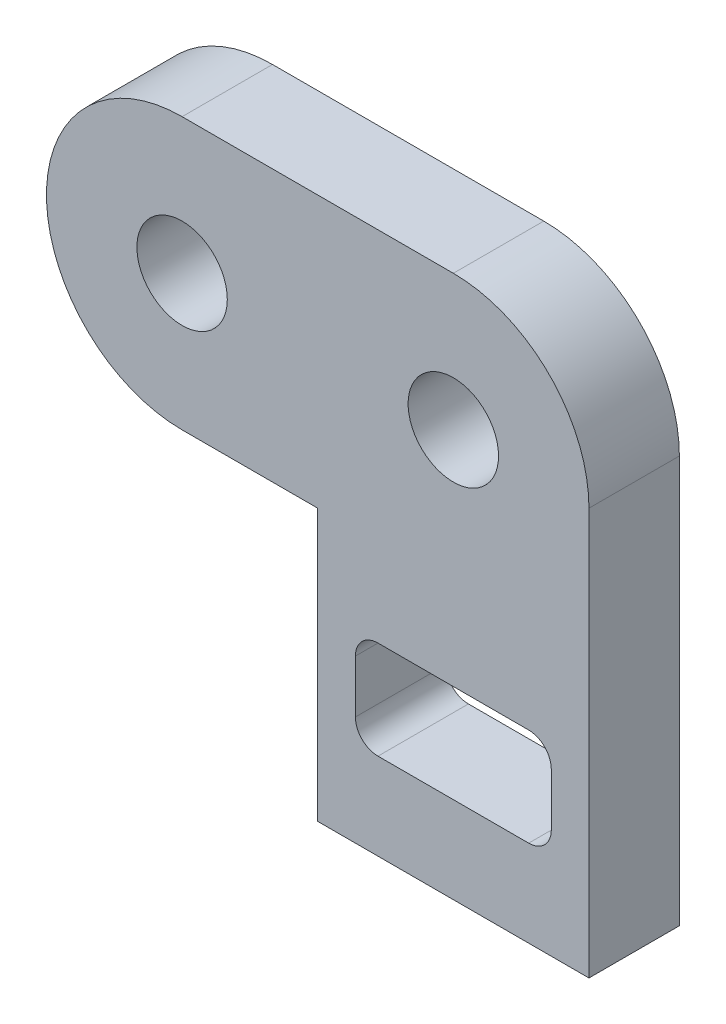
ISO-10303-21;
HEADER;
FILE_DESCRIPTION(('STEP AP214'),'2;1');
FILE_NAME('part.step','',(''),(''),'','','');
FILE_SCHEMA(('AUTOMOTIVE_DESIGN { 1 0 10303 214 1 1 1 1 }'));
ENDSEC;
DATA;
#1=APPLICATION_CONTEXT('core data for automotive mechanical design processes');
#2=APPLICATION_PROTOCOL_DEFINITION('international standard','automotive_design',2000,#1);
#3=PRODUCT_CONTEXT('',#1,'mechanical');
#4=PRODUCT('Part','Part','',(#3));
#5=PRODUCT_RELATED_PRODUCT_CATEGORY('part','',(#4));
#6=PRODUCT_DEFINITION_FORMATION('','',#4);
#7=PRODUCT_DEFINITION_CONTEXT('part definition',#1,'design');
#8=PRODUCT_DEFINITION('design','',#6,#7);
#9=PRODUCT_DEFINITION_SHAPE('','',#8);
#10=(LENGTH_UNIT() NAMED_UNIT(*) SI_UNIT(.MILLI.,.METRE.));
#11=(NAMED_UNIT(*) PLANE_ANGLE_UNIT() SI_UNIT($,.RADIAN.));
#12=(NAMED_UNIT(*) SI_UNIT($,.STERADIAN.) SOLID_ANGLE_UNIT());
#13=UNCERTAINTY_MEASURE_WITH_UNIT(LENGTH_MEASURE(1.E-05),#10,'distance_accuracy_value','');
#14=(GEOMETRIC_REPRESENTATION_CONTEXT(3) GLOBAL_UNCERTAINTY_ASSIGNED_CONTEXT((#13)) GLOBAL_UNIT_ASSIGNED_CONTEXT((#10,
#11,#12)) REPRESENTATION_CONTEXT('',''));
#15=CARTESIAN_POINT('',(0.,0.,0.));
#16=DIRECTION('',(0.,0.,1.));
#17=DIRECTION('',(1.,0.,0.));
#18=AXIS2_PLACEMENT_3D('',#15,#16,#17);
#19=CARTESIAN_POINT('',(149.3421335095,207.323953209,3.));
#20=DIRECTION('',(0.,0.,1.));
#21=DIRECTION('',(1.,0.,0.));
#22=AXIS2_PLACEMENT_3D('',#19,#20,#21);
#23=PLANE('',#22);
#24=CARTESIAN_POINT('',(158.3421335095,207.323953209,3.));
#25=DIRECTION('',(0.,0.,1.));
#26=DIRECTION('',(1.,0.,0.));
#27=AXIS2_PLACEMENT_3D('',#24,#25,#26);
#28=CIRCLE('',#27,1.5);
#29=CARTESIAN_POINT('',(159.8421335095,207.323953209,3.));
#30=VERTEX_POINT('',#29);
#31=EDGE_CURVE('E205',#30,#30,#28,.T.);
#32=ORIENTED_EDGE('',*,*,#31,.F.);
#33=EDGE_LOOP('',(#32));
#34=FACE_BOUND('',#33,.T.);
#35=CARTESIAN_POINT('',(149.3421335095,207.323953209,3.));
#36=DIRECTION('',(0.,0.,1.));
#37=DIRECTION('',(1.,0.,0.));
#38=AXIS2_PLACEMENT_3D('',#35,#36,#37);
#39=CIRCLE('',#38,4.49999999999999);
#40=CARTESIAN_POINT('',(149.3421335095,211.823953209,3.));
#41=VERTEX_POINT('',#40);
#42=CARTESIAN_POINT('',(149.3421335095,202.823953209,3.));
#43=VERTEX_POINT('',#42);
#44=EDGE_CURVE('E217',#41,#43,#39,.T.);
#45=ORIENTED_EDGE('',*,*,#44,.T.);
#46=DIRECTION('',(1.,0.,0.));
#47=VECTOR('',#46,1.);
#48=CARTESIAN_POINT('',(153.8421335095,202.823953209,3.));
#49=LINE('',#48,#47);
#50=CARTESIAN_POINT('',(153.8421335095,202.823953209,3.));
#51=VERTEX_POINT('',#50);
#52=EDGE_CURVE('E220',#43,#51,#49,.T.);
#53=ORIENTED_EDGE('',*,*,#52,.T.);
#54=DIRECTION('',(0.,-1.,0.));
#55=VECTOR('',#54,1.);
#56=CARTESIAN_POINT('',(153.8421335095,202.823953209,3.));
#57=LINE('',#56,#55);
#58=CARTESIAN_POINT('',(153.8421335095,193.823953209,3.));
#59=VERTEX_POINT('',#58);
#60=EDGE_CURVE('E223',#51,#59,#57,.T.);
#61=ORIENTED_EDGE('',*,*,#60,.T.);
#62=DIRECTION('',(1.,0.,0.));
#63=VECTOR('',#62,1.);
#64=CARTESIAN_POINT('',(153.8421335095,193.823953209,3.));
#65=LINE('',#64,#63);
#66=CARTESIAN_POINT('',(162.8421335095,193.823953209,3.));
#67=VERTEX_POINT('',#66);
#68=EDGE_CURVE('E225',#59,#67,#65,.T.);
#69=ORIENTED_EDGE('',*,*,#68,.T.);
#70=DIRECTION('',(0.,1.,0.));
#71=VECTOR('',#70,1.);
#72=CARTESIAN_POINT('',(162.8421335095,207.323953209,3.));
#73=LINE('',#72,#71);
#74=CARTESIAN_POINT('',(162.8421335095,207.323953209,3.));
#75=VERTEX_POINT('',#74);
#76=EDGE_CURVE('E227',#67,#75,#73,.T.);
#77=ORIENTED_EDGE('',*,*,#76,.T.);
#78=CARTESIAN_POINT('',(158.3421335095,207.323953209,3.));
#79=DIRECTION('',(0.,0.,1.));
#80=DIRECTION('',(1.,0.,0.));
#81=AXIS2_PLACEMENT_3D('',#78,#79,#80);
#82=CIRCLE('',#81,4.5);
#83=CARTESIAN_POINT('',(158.3421335095,211.823953209,3.));
#84=VERTEX_POINT('',#83);
#85=EDGE_CURVE('E229',#75,#84,#82,.T.);
#86=ORIENTED_EDGE('',*,*,#85,.T.);
#87=DIRECTION('',(-1.,0.,0.));
#88=VECTOR('',#87,1.);
#89=CARTESIAN_POINT('',(149.3421335095,211.823953209,3.));
#90=LINE('',#89,#88);
#91=EDGE_CURVE('E231',#84,#41,#90,.T.);
#92=ORIENTED_EDGE('',*,*,#91,.T.);
#93=EDGE_LOOP('',(#45,#53,#61,#69,#77,#86,#92));
#94=FACE_BOUND('',#93,.T.);
#95=CARTESIAN_POINT('',(149.3421335095,207.323953209,3.));
#96=DIRECTION('',(0.,0.,1.));
#97=DIRECTION('',(1.,0.,0.));
#98=AXIS2_PLACEMENT_3D('',#95,#96,#97);
#99=CIRCLE('',#98,1.5);
#100=CARTESIAN_POINT('',(150.8421335095,207.323953209,3.));
#101=VERTEX_POINT('',#100);
#102=EDGE_CURVE('E211',#101,#101,#99,.T.);
#103=ORIENTED_EDGE('',*,*,#102,.F.);
#104=EDGE_LOOP('',(#103));
#105=FACE_BOUND('',#104,.T.);
#106=DIRECTION('',(1.,0.,0.));
#107=VECTOR('',#106,1.);
#108=CARTESIAN_POINT('',(160.8421335095,196.698953209,3.));
#109=LINE('',#108,#107);
#110=CARTESIAN_POINT('',(155.8421335095,196.698953209,3.));
#111=VERTEX_POINT('',#110);
#112=CARTESIAN_POINT('',(160.8421335095,196.698953209,3.));
#113=VERTEX_POINT('',#112);
#114=EDGE_CURVE('E148',#111,#113,#109,.T.);
#115=ORIENTED_EDGE('',*,*,#114,.F.);
#116=CARTESIAN_POINT('',(155.8421335095,197.448953209,3.));
#117=DIRECTION('',(0.,0.,1.));
#118=DIRECTION('',(1.,0.,0.));
#119=AXIS2_PLACEMENT_3D('',#116,#117,#118);
#120=CIRCLE('',#119,0.749999999999987);
#121=CARTESIAN_POINT('',(155.0921335095,197.448953209,3.));
#122=VERTEX_POINT('',#121);
#123=EDGE_CURVE('E140',#122,#111,#120,.T.);
#124=ORIENTED_EDGE('',*,*,#123,.F.);
#125=DIRECTION('',(0.,-1.,0.));
#126=VECTOR('',#125,1.);
#127=CARTESIAN_POINT('',(155.0921335095,197.448953209,3.));
#128=LINE('',#127,#126);
#129=CARTESIAN_POINT('',(155.0921335095,199.198953209,3.));
#130=VERTEX_POINT('',#129);
#131=EDGE_CURVE('E173',#130,#122,#128,.T.);
#132=ORIENTED_EDGE('',*,*,#131,.F.);
#133=CARTESIAN_POINT('',(155.8421335095,199.198953209,3.));
#134=DIRECTION('',(0.,0.,1.));
#135=DIRECTION('',(1.,0.,0.));
#136=AXIS2_PLACEMENT_3D('',#133,#134,#135);
#137=CIRCLE('',#136,0.749999999999987);
#138=CARTESIAN_POINT('',(155.8421335095,199.948953209,3.));
#139=VERTEX_POINT('',#138);
#140=EDGE_CURVE('E171',#139,#130,#137,.T.);
#141=ORIENTED_EDGE('',*,*,#140,.F.);
#142=DIRECTION('',(-1.,0.,0.));
#143=VECTOR('',#142,1.);
#144=CARTESIAN_POINT('',(155.8421335095,199.948953209,3.));
#145=LINE('',#144,#143);
#146=CARTESIAN_POINT('',(160.8421335095,199.948953209,3.));
#147=VERTEX_POINT('',#146);
#148=EDGE_CURVE('E169',#147,#139,#145,.T.);
#149=ORIENTED_EDGE('',*,*,#148,.F.);
#150=CARTESIAN_POINT('',(160.8421335095,199.198953209,3.));
#151=DIRECTION('',(0.,0.,1.));
#152=DIRECTION('',(1.,0.,0.));
#153=AXIS2_PLACEMENT_3D('',#150,#151,#152);
#154=CIRCLE('',#153,0.750000000000001);
#155=CARTESIAN_POINT('',(161.5921335095,199.198953209,3.));
#156=VERTEX_POINT('',#155);
#157=EDGE_CURVE('E167',#156,#147,#154,.T.);
#158=ORIENTED_EDGE('',*,*,#157,.F.);
#159=DIRECTION('',(0.,1.,0.));
#160=VECTOR('',#159,1.);
#161=CARTESIAN_POINT('',(161.5921335095,199.198953209,3.));
#162=LINE('',#161,#160);
#163=CARTESIAN_POINT('',(161.5921335095,197.448953209,3.));
#164=VERTEX_POINT('',#163);
#165=EDGE_CURVE('E163',#164,#156,#162,.T.);
#166=ORIENTED_EDGE('',*,*,#165,.F.);
#167=CARTESIAN_POINT('',(160.8421335095,197.448953209,3.));
#168=DIRECTION('',(0.,0.,1.));
#169=DIRECTION('',(1.,0.,0.));
#170=AXIS2_PLACEMENT_3D('',#167,#168,#169);
#171=CIRCLE('',#170,0.750000000000001);
#172=EDGE_CURVE('E161',#113,#164,#171,.T.);
#173=ORIENTED_EDGE('',*,*,#172,.F.);
#174=EDGE_LOOP('',(#115,#124,#132,#141,#149,#158,#166,#173));
#175=FACE_BOUND('',#174,.T.);
#176=ADVANCED_FACE('F33',(#34,#94,#105,#175),#23,.T.);
#177=CARTESIAN_POINT('',(149.3421335095,207.323953209,0.));
#178=DIRECTION('',(0.,0.,1.));
#179=DIRECTION('',(1.,0.,0.));
#180=AXIS2_PLACEMENT_3D('',#177,#178,#179);
#181=PLANE('',#180);
#182=CARTESIAN_POINT('',(158.3421335095,207.323953209,0.));
#183=DIRECTION('',(0.,0.,1.));
#184=DIRECTION('',(1.,0.,0.));
#185=AXIS2_PLACEMENT_3D('',#182,#183,#184);
#186=CIRCLE('',#185,1.5);
#187=CARTESIAN_POINT('',(159.8421335095,207.323953209,0.));
#188=VERTEX_POINT('',#187);
#189=EDGE_CURVE('E156',#188,#188,#186,.T.);
#190=ORIENTED_EDGE('',*,*,#189,.T.);
#191=EDGE_LOOP('',(#190));
#192=FACE_BOUND('',#191,.T.);
#193=CARTESIAN_POINT('',(149.3421335095,207.323953209,0.));
#194=DIRECTION('',(0.,0.,1.));
#195=DIRECTION('',(1.,0.,0.));
#196=AXIS2_PLACEMENT_3D('',#193,#194,#195);
#197=CIRCLE('',#196,4.49999999999999);
#198=CARTESIAN_POINT('',(149.3421335095,211.823953209,0.));
#199=VERTEX_POINT('',#198);
#200=CARTESIAN_POINT('',(149.3421335095,202.823953209,0.));
#201=VERTEX_POINT('',#200);
#202=EDGE_CURVE('E214',#199,#201,#197,.T.);
#203=ORIENTED_EDGE('',*,*,#202,.F.);
#204=DIRECTION('',(-1.,0.,0.));
#205=VECTOR('',#204,1.);
#206=CARTESIAN_POINT('',(149.3421335095,211.823953209,0.));
#207=LINE('',#206,#205);
#208=CARTESIAN_POINT('',(158.3421335095,211.823953209,0.));
#209=VERTEX_POINT('',#208);
#210=EDGE_CURVE('E221',#209,#199,#207,.T.);
#211=ORIENTED_EDGE('',*,*,#210,.F.);
#212=CARTESIAN_POINT('',(158.3421335095,207.323953209,0.));
#213=DIRECTION('',(0.,0.,1.));
#214=DIRECTION('',(1.,0.,0.));
#215=AXIS2_PLACEMENT_3D('',#212,#213,#214);
#216=CIRCLE('',#215,4.5);
#217=CARTESIAN_POINT('',(162.8421335095,207.323953209,0.));
#218=VERTEX_POINT('',#217);
#219=EDGE_CURVE('E244',#218,#209,#216,.T.);
#220=ORIENTED_EDGE('',*,*,#219,.F.);
#221=DIRECTION('',(0.,1.,0.));
#222=VECTOR('',#221,1.);
#223=CARTESIAN_POINT('',(162.8421335095,207.323953209,0.));
#224=LINE('',#223,#222);
#225=CARTESIAN_POINT('',(162.8421335095,193.823953209,0.));
#226=VERTEX_POINT('',#225);
#227=EDGE_CURVE('E242',#226,#218,#224,.T.);
#228=ORIENTED_EDGE('',*,*,#227,.F.);
#229=DIRECTION('',(1.,0.,0.));
#230=VECTOR('',#229,1.);
#231=CARTESIAN_POINT('',(153.8421335095,193.823953209,0.));
#232=LINE('',#231,#230);
#233=CARTESIAN_POINT('',(153.8421335095,193.823953209,0.));
#234=VERTEX_POINT('',#233);
#235=EDGE_CURVE('E240',#234,#226,#232,.T.);
#236=ORIENTED_EDGE('',*,*,#235,.F.);
#237=DIRECTION('',(0.,-1.,0.));
#238=VECTOR('',#237,1.);
#239=CARTESIAN_POINT('',(153.8421335095,202.823953209,0.));
#240=LINE('',#239,#238);
#241=CARTESIAN_POINT('',(153.8421335095,202.823953209,0.));
#242=VERTEX_POINT('',#241);
#243=EDGE_CURVE('E238',#242,#234,#240,.T.);
#244=ORIENTED_EDGE('',*,*,#243,.F.);
#245=DIRECTION('',(1.,0.,0.));
#246=VECTOR('',#245,1.);
#247=CARTESIAN_POINT('',(153.8421335095,202.823953209,0.));
#248=LINE('',#247,#246);
#249=EDGE_CURVE('E236',#201,#242,#248,.T.);
#250=ORIENTED_EDGE('',*,*,#249,.F.);
#251=EDGE_LOOP('',(#203,#211,#220,#228,#236,#244,#250));
#252=FACE_BOUND('',#251,.T.);
#253=CARTESIAN_POINT('',(149.3421335095,207.323953209,0.));
#254=DIRECTION('',(0.,0.,1.));
#255=DIRECTION('',(1.,0.,0.));
#256=AXIS2_PLACEMENT_3D('',#253,#254,#255);
#257=CIRCLE('',#256,1.5);
#258=CARTESIAN_POINT('',(150.8421335095,207.323953209,0.));
#259=VERTEX_POINT('',#258);
#260=EDGE_CURVE('E208',#259,#259,#257,.T.);
#261=ORIENTED_EDGE('',*,*,#260,.T.);
#262=EDGE_LOOP('',(#261));
#263=FACE_BOUND('',#262,.T.);
#264=CARTESIAN_POINT('',(155.8421335095,197.448953209,0.));
#265=DIRECTION('',(0.,0.,1.));
#266=DIRECTION('',(1.,0.,0.));
#267=AXIS2_PLACEMENT_3D('',#264,#265,#266);
#268=CIRCLE('',#267,0.749999999999987);
#269=CARTESIAN_POINT('',(155.0921335095,197.448953209,0.));
#270=VERTEX_POINT('',#269);
#271=CARTESIAN_POINT('',(155.8421335095,196.698953209,0.));
#272=VERTEX_POINT('',#271);
#273=EDGE_CURVE('E56',#270,#272,#268,.T.);
#274=ORIENTED_EDGE('',*,*,#273,.T.);
#275=DIRECTION('',(1.,0.,0.));
#276=VECTOR('',#275,1.);
#277=CARTESIAN_POINT('',(160.8421335095,196.698953209,0.));
#278=LINE('',#277,#276);
#279=CARTESIAN_POINT('',(160.8421335095,196.698953209,0.));
#280=VERTEX_POINT('',#279);
#281=EDGE_CURVE('E155',#272,#280,#278,.T.);
#282=ORIENTED_EDGE('',*,*,#281,.T.);
#283=CARTESIAN_POINT('',(160.8421335095,197.448953209,0.));
#284=DIRECTION('',(0.,0.,1.));
#285=DIRECTION('',(1.,0.,0.));
#286=AXIS2_PLACEMENT_3D('',#283,#284,#285);
#287=CIRCLE('',#286,0.750000000000001);
#288=CARTESIAN_POINT('',(161.5921335095,197.448953209,0.));
#289=VERTEX_POINT('',#288);
#290=EDGE_CURVE('E177',#280,#289,#287,.T.);
#291=ORIENTED_EDGE('',*,*,#290,.T.);
#292=DIRECTION('',(0.,1.,0.));
#293=VECTOR('',#292,1.);
#294=CARTESIAN_POINT('',(161.5921335095,199.198953209,0.));
#295=LINE('',#294,#293);
#296=CARTESIAN_POINT('',(161.5921335095,199.198953209,0.));
#297=VERTEX_POINT('',#296);
#298=EDGE_CURVE('E180',#289,#297,#295,.T.);
#299=ORIENTED_EDGE('',*,*,#298,.T.);
#300=CARTESIAN_POINT('',(160.8421335095,199.198953209,0.));
#301=DIRECTION('',(0.,0.,1.));
#302=DIRECTION('',(1.,0.,0.));
#303=AXIS2_PLACEMENT_3D('',#300,#301,#302);
#304=CIRCLE('',#303,0.750000000000001);
#305=CARTESIAN_POINT('',(160.8421335095,199.948953209,0.));
#306=VERTEX_POINT('',#305);
#307=EDGE_CURVE('E183',#297,#306,#304,.T.);
#308=ORIENTED_EDGE('',*,*,#307,.T.);
#309=DIRECTION('',(-1.,0.,0.));
#310=VECTOR('',#309,1.);
#311=CARTESIAN_POINT('',(155.8421335095,199.948953209,0.));
#312=LINE('',#311,#310);
#313=CARTESIAN_POINT('',(155.8421335095,199.948953209,0.));
#314=VERTEX_POINT('',#313);
#315=EDGE_CURVE('E186',#306,#314,#312,.T.);
#316=ORIENTED_EDGE('',*,*,#315,.T.);
#317=CARTESIAN_POINT('',(155.8421335095,199.198953209,0.));
#318=DIRECTION('',(0.,0.,1.));
#319=DIRECTION('',(1.,0.,0.));
#320=AXIS2_PLACEMENT_3D('',#317,#318,#319);
#321=CIRCLE('',#320,0.749999999999987);
#322=CARTESIAN_POINT('',(155.0921335095,199.198953209,0.));
#323=VERTEX_POINT('',#322);
#324=EDGE_CURVE('E189',#314,#323,#321,.T.);
#325=ORIENTED_EDGE('',*,*,#324,.T.);
#326=DIRECTION('',(0.,-1.,0.));
#327=VECTOR('',#326,1.);
#328=CARTESIAN_POINT('',(155.0921335095,197.448953209,0.));
#329=LINE('',#328,#327);
#330=EDGE_CURVE('E149',#323,#270,#329,.T.);
#331=ORIENTED_EDGE('',*,*,#330,.T.);
#332=EDGE_LOOP('',(#274,#282,#291,#299,#308,#316,#325,#331));
#333=FACE_BOUND('',#332,.T.);
#334=ADVANCED_FACE('F271',(#192,#252,#263,#333),#181,.F.);
#335=CARTESIAN_POINT('',(149.3421335095,207.323953209,3.));
#336=DIRECTION('',(0.,0.,-1.));
#337=DIRECTION('',(-1.,0.,0.));
#338=AXIS2_PLACEMENT_3D('',#335,#336,#337);
#339=CYLINDRICAL_SURFACE('',#338,4.49999999999999);
#340=ORIENTED_EDGE('',*,*,#202,.T.);
#341=DIRECTION('',(0.,0.,-1.));
#342=VECTOR('',#341,1.);
#343=CARTESIAN_POINT('',(149.3421335095,202.823953209,3.));
#344=LINE('',#343,#342);
#345=EDGE_CURVE('E11',#43,#201,#344,.T.);
#346=ORIENTED_EDGE('',*,*,#345,.F.);
#347=ORIENTED_EDGE('',*,*,#44,.F.);
#348=DIRECTION('',(0.,0.,-1.));
#349=VECTOR('',#348,1.);
#350=CARTESIAN_POINT('',(149.3421335095,211.823953209,3.));
#351=LINE('',#350,#349);
#352=EDGE_CURVE('E233',#41,#199,#351,.T.);
#353=ORIENTED_EDGE('',*,*,#352,.T.);
#354=EDGE_LOOP('',(#340,#346,#347,#353));
#355=FACE_BOUND('',#354,.T.);
#356=ADVANCED_FACE('F35',(#355),#339,.T.);
#357=CARTESIAN_POINT('',(153.8421335095,202.823953209,3.));
#358=DIRECTION('',(0.,1.,0.));
#359=DIRECTION('',(0.,0.,1.));
#360=AXIS2_PLACEMENT_3D('',#357,#358,#359);
#361=PLANE('',#360);
#362=ORIENTED_EDGE('',*,*,#249,.T.);
#363=DIRECTION('',(0.,0.,-1.));
#364=VECTOR('',#363,1.);
#365=CARTESIAN_POINT('',(153.8421335095,202.823953209,3.));
#366=LINE('',#365,#364);
#367=EDGE_CURVE('E41',#51,#242,#366,.T.);
#368=ORIENTED_EDGE('',*,*,#367,.F.);
#369=ORIENTED_EDGE('',*,*,#52,.F.);
#370=ORIENTED_EDGE('',*,*,#345,.T.);
#371=EDGE_LOOP('',(#362,#368,#369,#370));
#372=FACE_BOUND('',#371,.T.);
#373=ADVANCED_FACE('F289',(#372),#361,.F.);
#374=CARTESIAN_POINT('',(153.8421335095,202.823953209,3.));
#375=DIRECTION('',(1.,0.,0.));
#376=DIRECTION('',(0.,0.,-1.));
#377=AXIS2_PLACEMENT_3D('',#374,#375,#376);
#378=PLANE('',#377);
#379=ORIENTED_EDGE('',*,*,#243,.T.);
#380=DIRECTION('',(0.,0.,-1.));
#381=VECTOR('',#380,1.);
#382=CARTESIAN_POINT('',(153.8421335095,193.823953209,3.));
#383=LINE('',#382,#381);
#384=EDGE_CURVE('E258',#59,#234,#383,.T.);
#385=ORIENTED_EDGE('',*,*,#384,.F.);
#386=ORIENTED_EDGE('',*,*,#60,.F.);
#387=ORIENTED_EDGE('',*,*,#367,.T.);
#388=EDGE_LOOP('',(#379,#385,#386,#387));
#389=FACE_BOUND('',#388,.T.);
#390=ADVANCED_FACE('F265',(#389),#378,.F.);
#391=CARTESIAN_POINT('',(153.8421335095,193.823953209,3.));
#392=DIRECTION('',(0.,1.,0.));
#393=DIRECTION('',(0.,0.,1.));
#394=AXIS2_PLACEMENT_3D('',#391,#392,#393);
#395=PLANE('',#394);
#396=ORIENTED_EDGE('',*,*,#235,.T.);
#397=DIRECTION('',(0.,0.,-1.));
#398=VECTOR('',#397,1.);
#399=CARTESIAN_POINT('',(162.8421335095,193.823953209,3.));
#400=LINE('',#399,#398);
#401=EDGE_CURVE('E255',#67,#226,#400,.T.);
#402=ORIENTED_EDGE('',*,*,#401,.F.);
#403=ORIENTED_EDGE('',*,*,#68,.F.);
#404=ORIENTED_EDGE('',*,*,#384,.T.);
#405=EDGE_LOOP('',(#396,#402,#403,#404));
#406=FACE_BOUND('',#405,.T.);
#407=ADVANCED_FACE('F277',(#406),#395,.F.);
#408=CARTESIAN_POINT('',(162.8421335095,207.323953209,3.));
#409=DIRECTION('',(-1.,0.,0.));
#410=DIRECTION('',(0.,0.,1.));
#411=AXIS2_PLACEMENT_3D('',#408,#409,#410);
#412=PLANE('',#411);
#413=ORIENTED_EDGE('',*,*,#227,.T.);
#414=DIRECTION('',(0.,0.,-1.));
#415=VECTOR('',#414,1.);
#416=CARTESIAN_POINT('',(162.8421335095,207.323953209,3.));
#417=LINE('',#416,#415);
#418=EDGE_CURVE('E252',#75,#218,#417,.T.);
#419=ORIENTED_EDGE('',*,*,#418,.F.);
#420=ORIENTED_EDGE('',*,*,#76,.F.);
#421=ORIENTED_EDGE('',*,*,#401,.T.);
#422=EDGE_LOOP('',(#413,#419,#420,#421));
#423=FACE_BOUND('',#422,.T.);
#424=ADVANCED_FACE('F281',(#423),#412,.F.);
#425=CARTESIAN_POINT('',(158.3421335095,207.323953209,3.));
#426=DIRECTION('',(0.,0.,-1.));
#427=DIRECTION('',(-1.,0.,0.));
#428=AXIS2_PLACEMENT_3D('',#425,#426,#427);
#429=CYLINDRICAL_SURFACE('',#428,4.5);
#430=ORIENTED_EDGE('',*,*,#219,.T.);
#431=DIRECTION('',(0.,0.,-1.));
#432=VECTOR('',#431,1.);
#433=CARTESIAN_POINT('',(158.3421335095,211.823953209,3.));
#434=LINE('',#433,#432);
#435=EDGE_CURVE('E249',#84,#209,#434,.T.);
#436=ORIENTED_EDGE('',*,*,#435,.F.);
#437=ORIENTED_EDGE('',*,*,#85,.F.);
#438=ORIENTED_EDGE('',*,*,#418,.T.);
#439=EDGE_LOOP('',(#430,#436,#437,#438));
#440=FACE_BOUND('',#439,.T.);
#441=ADVANCED_FACE('F297',(#440),#429,.T.);
#442=CARTESIAN_POINT('',(149.3421335095,211.823953209,3.));
#443=DIRECTION('',(0.,-1.,0.));
#444=DIRECTION('',(0.,0.,-1.));
#445=AXIS2_PLACEMENT_3D('',#442,#443,#444);
#446=PLANE('',#445);
#447=ORIENTED_EDGE('',*,*,#210,.T.);
#448=ORIENTED_EDGE('',*,*,#352,.F.);
#449=ORIENTED_EDGE('',*,*,#91,.F.);
#450=ORIENTED_EDGE('',*,*,#435,.T.);
#451=EDGE_LOOP('',(#447,#448,#449,#450));
#452=FACE_BOUND('',#451,.T.);
#453=ADVANCED_FACE('F294',(#452),#446,.F.);
#454=CARTESIAN_POINT('',(149.3421335095,207.323953209,3.));
#455=DIRECTION('',(0.,0.,-1.));
#456=DIRECTION('',(-1.,0.,0.));
#457=AXIS2_PLACEMENT_3D('',#454,#455,#456);
#458=CYLINDRICAL_SURFACE('',#457,1.5);
#459=ORIENTED_EDGE('',*,*,#102,.T.);
#460=EDGE_LOOP('',(#459));
#461=FACE_BOUND('',#460,.T.);
#462=ORIENTED_EDGE('',*,*,#260,.F.);
#463=EDGE_LOOP('',(#462));
#464=FACE_BOUND('',#463,.T.);
#465=ADVANCED_FACE('F304',(#461,#464),#458,.F.);
#466=CARTESIAN_POINT('',(158.3421335095,207.323953209,3.));
#467=DIRECTION('',(0.,0.,-1.));
#468=DIRECTION('',(-1.,0.,0.));
#469=AXIS2_PLACEMENT_3D('',#466,#467,#468);
#470=CYLINDRICAL_SURFACE('',#469,1.5);
#471=ORIENTED_EDGE('',*,*,#31,.T.);
#472=EDGE_LOOP('',(#471));
#473=FACE_BOUND('',#472,.T.);
#474=ORIENTED_EDGE('',*,*,#189,.F.);
#475=EDGE_LOOP('',(#474));
#476=FACE_BOUND('',#475,.T.);
#477=ADVANCED_FACE('F319',(#473,#476),#470,.F.);
#478=CARTESIAN_POINT('',(155.8421335095,197.448953209,3.));
#479=DIRECTION('',(0.,0.,-1.));
#480=DIRECTION('',(-1.,0.,0.));
#481=AXIS2_PLACEMENT_3D('',#478,#479,#480);
#482=CYLINDRICAL_SURFACE('',#481,0.749999999999987);
#483=ORIENTED_EDGE('',*,*,#273,.F.);
#484=DIRECTION('',(0.,0.,-1.));
#485=VECTOR('',#484,1.);
#486=CARTESIAN_POINT('',(155.0921335095,197.448953209,3.));
#487=LINE('',#486,#485);
#488=EDGE_CURVE('E144',#122,#270,#487,.T.);
#489=ORIENTED_EDGE('',*,*,#488,.F.);
#490=ORIENTED_EDGE('',*,*,#123,.T.);
#491=DIRECTION('',(0.,0.,-1.));
#492=VECTOR('',#491,1.);
#493=CARTESIAN_POINT('',(155.8421335095,196.698953209,3.));
#494=LINE('',#493,#492);
#495=EDGE_CURVE('E143',#111,#272,#494,.T.);
#496=ORIENTED_EDGE('',*,*,#495,.T.);
#497=EDGE_LOOP('',(#483,#489,#490,#496));
#498=FACE_BOUND('',#497,.T.);
#499=ADVANCED_FACE('F142',(#498),#482,.F.);
#500=CARTESIAN_POINT('',(160.8421335095,196.698953209,3.));
#501=DIRECTION('',(0.,1.,0.));
#502=DIRECTION('',(0.,0.,1.));
#503=AXIS2_PLACEMENT_3D('',#500,#501,#502);
#504=PLANE('',#503);
#505=ORIENTED_EDGE('',*,*,#281,.F.);
#506=ORIENTED_EDGE('',*,*,#495,.F.);
#507=ORIENTED_EDGE('',*,*,#114,.T.);
#508=DIRECTION('',(0.,0.,-1.));
#509=VECTOR('',#508,1.);
#510=CARTESIAN_POINT('',(160.8421335095,196.698953209,3.));
#511=LINE('',#510,#509);
#512=EDGE_CURVE('E157',#113,#280,#511,.T.);
#513=ORIENTED_EDGE('',*,*,#512,.T.);
#514=EDGE_LOOP('',(#505,#506,#507,#513));
#515=FACE_BOUND('',#514,.T.);
#516=ADVANCED_FACE('F152',(#515),#504,.T.);
#517=CARTESIAN_POINT('',(160.8421335095,197.448953209,3.));
#518=DIRECTION('',(0.,0.,-1.));
#519=DIRECTION('',(-1.,0.,0.));
#520=AXIS2_PLACEMENT_3D('',#517,#518,#519);
#521=CYLINDRICAL_SURFACE('',#520,0.750000000000001);
#522=ORIENTED_EDGE('',*,*,#290,.F.);
#523=ORIENTED_EDGE('',*,*,#512,.F.);
#524=ORIENTED_EDGE('',*,*,#172,.T.);
#525=DIRECTION('',(0.,0.,-1.));
#526=VECTOR('',#525,1.);
#527=CARTESIAN_POINT('',(161.5921335095,197.448953209,3.));
#528=LINE('',#527,#526);
#529=EDGE_CURVE('E202',#164,#289,#528,.T.);
#530=ORIENTED_EDGE('',*,*,#529,.T.);
#531=EDGE_LOOP('',(#522,#523,#524,#530));
#532=FACE_BOUND('',#531,.T.);
#533=ADVANCED_FACE('F328',(#532),#521,.F.);
#534=CARTESIAN_POINT('',(161.5921335095,199.198953209,3.));
#535=DIRECTION('',(-1.,0.,0.));
#536=DIRECTION('',(0.,0.,1.));
#537=AXIS2_PLACEMENT_3D('',#534,#535,#536);
#538=PLANE('',#537);
#539=ORIENTED_EDGE('',*,*,#298,.F.);
#540=ORIENTED_EDGE('',*,*,#529,.F.);
#541=ORIENTED_EDGE('',*,*,#165,.T.);
#542=DIRECTION('',(0.,0.,-1.));
#543=VECTOR('',#542,1.);
#544=CARTESIAN_POINT('',(161.5921335095,199.198953209,3.));
#545=LINE('',#544,#543);
#546=EDGE_CURVE('E200',#156,#297,#545,.T.);
#547=ORIENTED_EDGE('',*,*,#546,.T.);
#548=EDGE_LOOP('',(#539,#540,#541,#547));
#549=FACE_BOUND('',#548,.T.);
#550=ADVANCED_FACE('F331',(#549),#538,.T.);
#551=CARTESIAN_POINT('',(160.8421335095,199.198953209,3.));
#552=DIRECTION('',(0.,0.,-1.));
#553=DIRECTION('',(-1.,0.,0.));
#554=AXIS2_PLACEMENT_3D('',#551,#552,#553);
#555=CYLINDRICAL_SURFACE('',#554,0.750000000000001);
#556=ORIENTED_EDGE('',*,*,#307,.F.);
#557=ORIENTED_EDGE('',*,*,#546,.F.);
#558=ORIENTED_EDGE('',*,*,#157,.T.);
#559=DIRECTION('',(0.,0.,-1.));
#560=VECTOR('',#559,1.);
#561=CARTESIAN_POINT('',(160.8421335095,199.948953209,3.));
#562=LINE('',#561,#560);
#563=EDGE_CURVE('E198',#147,#306,#562,.T.);
#564=ORIENTED_EDGE('',*,*,#563,.T.);
#565=EDGE_LOOP('',(#556,#557,#558,#564));
#566=FACE_BOUND('',#565,.T.);
#567=ADVANCED_FACE('F335',(#566),#555,.F.);
#568=CARTESIAN_POINT('',(155.8421335095,199.948953209,3.));
#569=DIRECTION('',(0.,-1.,0.));
#570=DIRECTION('',(0.,0.,-1.));
#571=AXIS2_PLACEMENT_3D('',#568,#569,#570);
#572=PLANE('',#571);
#573=ORIENTED_EDGE('',*,*,#315,.F.);
#574=ORIENTED_EDGE('',*,*,#563,.F.);
#575=ORIENTED_EDGE('',*,*,#148,.T.);
#576=DIRECTION('',(0.,0.,-1.));
#577=VECTOR('',#576,1.);
#578=CARTESIAN_POINT('',(155.8421335095,199.948953209,3.));
#579=LINE('',#578,#577);
#580=EDGE_CURVE('E196',#139,#314,#579,.T.);
#581=ORIENTED_EDGE('',*,*,#580,.T.);
#582=EDGE_LOOP('',(#573,#574,#575,#581));
#583=FACE_BOUND('',#582,.T.);
#584=ADVANCED_FACE('F339',(#583),#572,.T.);
#585=CARTESIAN_POINT('',(155.8421335095,199.198953209,3.));
#586=DIRECTION('',(0.,0.,-1.));
#587=DIRECTION('',(-1.,0.,0.));
#588=AXIS2_PLACEMENT_3D('',#585,#586,#587);
#589=CYLINDRICAL_SURFACE('',#588,0.749999999999987);
#590=ORIENTED_EDGE('',*,*,#324,.F.);
#591=ORIENTED_EDGE('',*,*,#580,.F.);
#592=ORIENTED_EDGE('',*,*,#140,.T.);
#593=DIRECTION('',(0.,0.,-1.));
#594=VECTOR('',#593,1.);
#595=CARTESIAN_POINT('',(155.0921335095,199.198953209,3.));
#596=LINE('',#595,#594);
#597=EDGE_CURVE('E48',#130,#323,#596,.T.);
#598=ORIENTED_EDGE('',*,*,#597,.T.);
#599=EDGE_LOOP('',(#590,#591,#592,#598));
#600=FACE_BOUND('',#599,.T.);
#601=ADVANCED_FACE('F343',(#600),#589,.F.);
#602=CARTESIAN_POINT('',(155.0921335095,197.448953209,3.));
#603=DIRECTION('',(1.,0.,0.));
#604=DIRECTION('',(0.,0.,-1.));
#605=AXIS2_PLACEMENT_3D('',#602,#603,#604);
#606=PLANE('',#605);
#607=ORIENTED_EDGE('',*,*,#330,.F.);
#608=ORIENTED_EDGE('',*,*,#597,.F.);
#609=ORIENTED_EDGE('',*,*,#131,.T.);
#610=ORIENTED_EDGE('',*,*,#488,.T.);
#611=EDGE_LOOP('',(#607,#608,#609,#610));
#612=FACE_BOUND('',#611,.T.);
#613=ADVANCED_FACE('F347',(#612),#606,.T.);
#614=CLOSED_SHELL('',(#176,#334,#356,#373,#390,#407,#424,#441,#453,#465,#477,#499,#516,#533,
#550,#567,#584,#601,#613));
#615=MANIFOLD_SOLID_BREP('B2',#614);
#616=ADVANCED_BREP_SHAPE_REPRESENTATION('',(#18,#615),#14);
#617=SHAPE_DEFINITION_REPRESENTATION(#9,#616);
ENDSEC;
END-ISO-10303-21;
